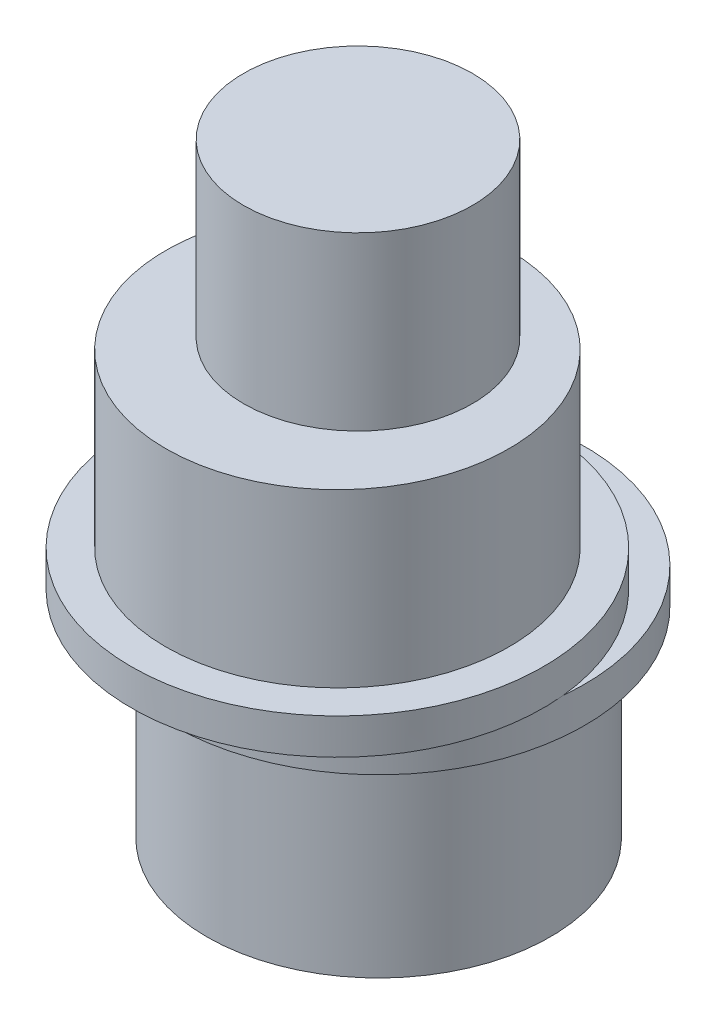
ISO-10303-21;
HEADER;
FILE_DESCRIPTION(('STEP AP214'),'2;1');
FILE_NAME('part.step','',(''),(''),'','','');
FILE_SCHEMA(('AUTOMOTIVE_DESIGN { 1 0 10303 214 1 1 1 1 }'));
ENDSEC;
DATA;
#1=APPLICATION_CONTEXT('core data for automotive mechanical design processes');
#2=APPLICATION_PROTOCOL_DEFINITION('international standard','automotive_design',2000,#1);
#3=PRODUCT_CONTEXT('',#1,'mechanical');
#4=PRODUCT('Part','Part','',(#3));
#5=PRODUCT_RELATED_PRODUCT_CATEGORY('part','',(#4));
#6=PRODUCT_DEFINITION_FORMATION('','',#4);
#7=PRODUCT_DEFINITION_CONTEXT('part definition',#1,'design');
#8=PRODUCT_DEFINITION('design','',#6,#7);
#9=PRODUCT_DEFINITION_SHAPE('','',#8);
#10=(LENGTH_UNIT() NAMED_UNIT(*) SI_UNIT(.MILLI.,.METRE.));
#11=(NAMED_UNIT(*) PLANE_ANGLE_UNIT() SI_UNIT($,.RADIAN.));
#12=(NAMED_UNIT(*) SI_UNIT($,.STERADIAN.) SOLID_ANGLE_UNIT());
#13=UNCERTAINTY_MEASURE_WITH_UNIT(LENGTH_MEASURE(1.E-05),#10,'distance_accuracy_value','');
#14=(GEOMETRIC_REPRESENTATION_CONTEXT(3) GLOBAL_UNCERTAINTY_ASSIGNED_CONTEXT((#13)) GLOBAL_UNIT_ASSIGNED_CONTEXT((#10,
#11,#12)) REPRESENTATION_CONTEXT('',''));
#15=CARTESIAN_POINT('',(0.,0.,0.));
#16=DIRECTION('',(0.,0.,1.));
#17=DIRECTION('',(1.,0.,0.));
#18=AXIS2_PLACEMENT_3D('',#15,#16,#17);
#19=CARTESIAN_POINT('',(0.,7.,-0.72));
#20=DIRECTION('',(0.,-1.,0.));
#21=DIRECTION('',(0.,0.,-1.));
#22=AXIS2_PLACEMENT_3D('',#19,#20,#21);
#23=CYLINDRICAL_SURFACE('',#22,6.);
#24=CARTESIAN_POINT('',(0.,7.,-0.72));
#25=DIRECTION('',(0.,1.,0.));
#26=DIRECTION('',(0.,0.,1.));
#27=AXIS2_PLACEMENT_3D('',#24,#25,#26);
#28=CIRCLE('',#27,6.);
#29=CARTESIAN_POINT('',(0.,7.,5.28));
#30=VERTEX_POINT('',#29);
#31=EDGE_CURVE('E108',#30,#30,#28,.T.);
#32=ORIENTED_EDGE('',*,*,#31,.F.);
#33=EDGE_LOOP('',(#32));
#34=FACE_BOUND('',#33,.T.);
#35=CARTESIAN_POINT('',(0.,0.,-0.72));
#36=DIRECTION('',(0.,1.,0.));
#37=DIRECTION('',(0.,0.,1.));
#38=AXIS2_PLACEMENT_3D('',#35,#36,#37);
#39=CIRCLE('',#38,6.);
#40=CARTESIAN_POINT('',(0.,0.,5.28));
#41=VERTEX_POINT('',#40);
#42=EDGE_CURVE('E121',#41,#41,#39,.T.);
#43=ORIENTED_EDGE('',*,*,#42,.T.);
#44=EDGE_LOOP('',(#43));
#45=FACE_BOUND('',#44,.T.);
#46=ADVANCED_FACE('F45',(#34,#45),#23,.T.);
#47=CARTESIAN_POINT('',(0.,0.,-0.72));
#48=DIRECTION('',(0.,1.,0.));
#49=DIRECTION('',(0.,0.,1.));
#50=AXIS2_PLACEMENT_3D('',#47,#48,#49);
#51=PLANE('',#50);
#52=DIRECTION('',(1.,0.,0.));
#53=VECTOR('',#52,1.);
#54=CARTESIAN_POINT('',(0.,0.,2.1));
#55=LINE('',#54,#53);
#56=CARTESIAN_POINT('',(-1.49017616408262,0.,2.1));
#57=VERTEX_POINT('',#56);
#58=CARTESIAN_POINT('',(1.49017616408262,0.,2.1));
#59=VERTEX_POINT('',#58);
#60=EDGE_CURVE('E107',#57,#59,#55,.T.);
#61=ORIENTED_EDGE('',*,*,#60,.T.);
#62=CARTESIAN_POINT('',(0.,0.,0.));
#63=DIRECTION('',(0.,-1.,0.));
#64=DIRECTION('',(0.,0.,-1.));
#65=AXIS2_PLACEMENT_3D('',#62,#63,#64);
#66=CIRCLE('',#65,2.575);
#67=EDGE_CURVE('E48',#59,#57,#66,.F.);
#68=ORIENTED_EDGE('',*,*,#67,.T.);
#69=EDGE_LOOP('',(#61,#68));
#70=FACE_BOUND('',#69,.T.);
#71=ORIENTED_EDGE('',*,*,#42,.F.);
#72=EDGE_LOOP('',(#71));
#73=FACE_BOUND('',#72,.T.);
#74=ADVANCED_FACE('F134',(#70,#73),#51,.F.);
#75=CARTESIAN_POINT('',(0.,8.25,-0.72));
#76=DIRECTION('',(0.,-1.,0.));
#77=DIRECTION('',(0.,0.,-1.));
#78=AXIS2_PLACEMENT_3D('',#75,#76,#77);
#79=CYLINDRICAL_SURFACE('',#78,7.2);
#80=CARTESIAN_POINT('',(0.,8.25,-0.72));
#81=DIRECTION('',(0.,1.,0.));
#82=DIRECTION('',(0.,0.,1.));
#83=AXIS2_PLACEMENT_3D('',#80,#81,#82);
#84=CIRCLE('',#83,7.2);
#85=CARTESIAN_POINT('',(7.16390954716766,8.25,0.));
#86=VERTEX_POINT('',#85);
#87=CARTESIAN_POINT('',(-7.16390954716766,8.25,0.));
#88=VERTEX_POINT('',#87);
#89=EDGE_CURVE('E118',#86,#88,#84,.T.);
#90=ORIENTED_EDGE('',*,*,#89,.F.);
#91=EDGE_CURVE('E122',#88,#86,#84,.T.);
#92=ORIENTED_EDGE('',*,*,#91,.F.);
#93=EDGE_LOOP('',(#90,#92));
#94=FACE_BOUND('',#93,.T.);
#95=CARTESIAN_POINT('',(0.,7.,-0.72));
#96=DIRECTION('',(0.,1.,0.));
#97=DIRECTION('',(0.,0.,1.));
#98=AXIS2_PLACEMENT_3D('',#95,#96,#97);
#99=CIRCLE('',#98,7.2);
#100=CARTESIAN_POINT('',(0.,7.,6.48));
#101=VERTEX_POINT('',#100);
#102=EDGE_CURVE('E113',#101,#101,#99,.T.);
#103=ORIENTED_EDGE('',*,*,#102,.T.);
#104=EDGE_LOOP('',(#103));
#105=FACE_BOUND('',#104,.T.);
#106=ADVANCED_FACE('F137',(#94,#105),#79,.T.);
#107=CARTESIAN_POINT('',(0.,8.25,-0.72));
#108=DIRECTION('',(0.,1.,0.));
#109=DIRECTION('',(0.,0.,1.));
#110=AXIS2_PLACEMENT_3D('',#107,#108,#109);
#111=PLANE('',#110);
#112=CARTESIAN_POINT('',(0.,8.25,0.72));
#113=DIRECTION('',(0.,1.,0.));
#114=DIRECTION('',(0.,0.,1.));
#115=AXIS2_PLACEMENT_3D('',#112,#113,#114);
#116=CIRCLE('',#115,7.2);
#117=EDGE_CURVE('E114',#86,#88,#116,.T.);
#118=ORIENTED_EDGE('',*,*,#117,.F.);
#119=ORIENTED_EDGE('',*,*,#89,.T.);
#120=EDGE_LOOP('',(#118,#119));
#121=FACE_BOUND('',#120,.T.);
#122=ADVANCED_FACE('F150',(#121),#111,.T.);
#123=CARTESIAN_POINT('',(0.,7.,-0.72));
#124=DIRECTION('',(0.,1.,0.));
#125=DIRECTION('',(0.,0.,1.));
#126=AXIS2_PLACEMENT_3D('',#123,#124,#125);
#127=PLANE('',#126);
#128=ORIENTED_EDGE('',*,*,#31,.T.);
#129=EDGE_LOOP('',(#128));
#130=FACE_BOUND('',#129,.T.);
#131=ORIENTED_EDGE('',*,*,#102,.F.);
#132=EDGE_LOOP('',(#131));
#133=FACE_BOUND('',#132,.T.);
#134=ADVANCED_FACE('F147',(#130,#133),#127,.F.);
#135=CARTESIAN_POINT('',(0.,8.25,0.72));
#136=DIRECTION('',(0.,1.,0.));
#137=DIRECTION('',(0.,0.,1.));
#138=AXIS2_PLACEMENT_3D('',#135,#136,#137);
#139=PLANE('',#138);
#140=EDGE_CURVE('E102',#88,#86,#116,.T.);
#141=ORIENTED_EDGE('',*,*,#140,.F.);
#142=ORIENTED_EDGE('',*,*,#91,.T.);
#143=EDGE_LOOP('',(#141,#142));
#144=FACE_BOUND('',#143,.T.);
#145=ADVANCED_FACE('F149',(#144),#139,.F.);
#146=CARTESIAN_POINT('',(0.,9.5,0.72));
#147=DIRECTION('',(0.,-1.,0.));
#148=DIRECTION('',(0.,0.,-1.));
#149=AXIS2_PLACEMENT_3D('',#146,#147,#148);
#150=CYLINDRICAL_SURFACE('',#149,7.2);
#151=CARTESIAN_POINT('',(0.,9.5,0.72));
#152=DIRECTION('',(0.,1.,0.));
#153=DIRECTION('',(0.,0.,1.));
#154=AXIS2_PLACEMENT_3D('',#151,#152,#153);
#155=CIRCLE('',#154,7.2);
#156=CARTESIAN_POINT('',(0.,9.5,7.92));
#157=VERTEX_POINT('',#156);
#158=EDGE_CURVE('E109',#157,#157,#155,.T.);
#159=ORIENTED_EDGE('',*,*,#158,.F.);
#160=EDGE_LOOP('',(#159));
#161=FACE_BOUND('',#160,.T.);
#162=ORIENTED_EDGE('',*,*,#117,.T.);
#163=ORIENTED_EDGE('',*,*,#140,.T.);
#164=EDGE_LOOP('',(#162,#163));
#165=FACE_BOUND('',#164,.T.);
#166=ADVANCED_FACE('F164',(#161,#165),#150,.T.);
#167=CARTESIAN_POINT('',(0.,9.5,0.72));
#168=DIRECTION('',(0.,1.,0.));
#169=DIRECTION('',(0.,0.,1.));
#170=AXIS2_PLACEMENT_3D('',#167,#168,#169);
#171=PLANE('',#170);
#172=CARTESIAN_POINT('',(0.,9.5,0.72));
#173=DIRECTION('',(0.,1.,0.));
#174=DIRECTION('',(0.,0.,1.));
#175=AXIS2_PLACEMENT_3D('',#172,#173,#174);
#176=CIRCLE('',#175,6.);
#177=CARTESIAN_POINT('',(0.,9.5,6.72));
#178=VERTEX_POINT('',#177);
#179=EDGE_CURVE('E103',#178,#178,#176,.T.);
#180=ORIENTED_EDGE('',*,*,#179,.F.);
#181=EDGE_LOOP('',(#180));
#182=FACE_BOUND('',#181,.T.);
#183=ORIENTED_EDGE('',*,*,#158,.T.);
#184=EDGE_LOOP('',(#183));
#185=FACE_BOUND('',#184,.T.);
#186=ADVANCED_FACE('F167',(#182,#185),#171,.T.);
#187=CARTESIAN_POINT('',(0.,15.5,0.72));
#188=DIRECTION('',(0.,-1.,0.));
#189=DIRECTION('',(0.,0.,-1.));
#190=AXIS2_PLACEMENT_3D('',#187,#188,#189);
#191=CYLINDRICAL_SURFACE('',#190,6.);
#192=CARTESIAN_POINT('',(0.,15.5,0.72));
#193=DIRECTION('',(0.,1.,0.));
#194=DIRECTION('',(0.,0.,1.));
#195=AXIS2_PLACEMENT_3D('',#192,#193,#194);
#196=CIRCLE('',#195,6.);
#197=CARTESIAN_POINT('',(0.,15.5,6.72));
#198=VERTEX_POINT('',#197);
#199=EDGE_CURVE('E98',#198,#198,#196,.T.);
#200=ORIENTED_EDGE('',*,*,#199,.F.);
#201=EDGE_LOOP('',(#200));
#202=FACE_BOUND('',#201,.T.);
#203=ORIENTED_EDGE('',*,*,#179,.T.);
#204=EDGE_LOOP('',(#203));
#205=FACE_BOUND('',#204,.T.);
#206=ADVANCED_FACE('F174',(#202,#205),#191,.T.);
#207=CARTESIAN_POINT('',(0.,15.5,0.72));
#208=DIRECTION('',(0.,1.,0.));
#209=DIRECTION('',(0.,0.,1.));
#210=AXIS2_PLACEMENT_3D('',#207,#208,#209);
#211=PLANE('',#210);
#212=CARTESIAN_POINT('',(0.,15.5,0.));
#213=DIRECTION('',(0.,1.,0.));
#214=DIRECTION('',(0.,0.,1.));
#215=AXIS2_PLACEMENT_3D('',#212,#213,#214);
#216=CIRCLE('',#215,4.);
#217=CARTESIAN_POINT('',(0.,15.5,4.));
#218=VERTEX_POINT('',#217);
#219=EDGE_CURVE('E11',#218,#218,#216,.T.);
#220=ORIENTED_EDGE('',*,*,#219,.F.);
#221=EDGE_LOOP('',(#220));
#222=FACE_BOUND('',#221,.T.);
#223=ORIENTED_EDGE('',*,*,#199,.T.);
#224=EDGE_LOOP('',(#223));
#225=FACE_BOUND('',#224,.T.);
#226=ADVANCED_FACE('F178',(#222,#225),#211,.T.);
#227=CARTESIAN_POINT('',(0.,11.,0.));
#228=DIRECTION('',(0.,-1.,0.));
#229=DIRECTION('',(0.,0.,-1.));
#230=AXIS2_PLACEMENT_3D('',#227,#228,#229);
#231=CYLINDRICAL_SURFACE('',#230,2.575);
#232=DIRECTION('',(0.,-1.,0.));
#233=VECTOR('',#232,1.);
#234=CARTESIAN_POINT('',(1.49017616408262,11.,2.1));
#235=LINE('',#234,#233);
#236=CARTESIAN_POINT('',(1.49017616408262,11.,2.1));
#237=VERTEX_POINT('',#236);
#238=EDGE_CURVE('E62',#237,#59,#235,.T.);
#239=ORIENTED_EDGE('',*,*,#238,.F.);
#240=CARTESIAN_POINT('',(0.,11.,0.));
#241=DIRECTION('',(0.,-1.,0.));
#242=DIRECTION('',(0.,0.,-1.));
#243=AXIS2_PLACEMENT_3D('',#240,#241,#242);
#244=CIRCLE('',#243,2.575);
#245=CARTESIAN_POINT('',(-1.49017616408262,11.,2.1));
#246=VERTEX_POINT('',#245);
#247=EDGE_CURVE('E79',#246,#237,#244,.T.);
#248=ORIENTED_EDGE('',*,*,#247,.F.);
#249=DIRECTION('',(0.,-1.,0.));
#250=VECTOR('',#249,1.);
#251=CARTESIAN_POINT('',(-1.49017616408262,11.,2.1));
#252=LINE('',#251,#250);
#253=EDGE_CURVE('E84',#246,#57,#252,.T.);
#254=ORIENTED_EDGE('',*,*,#253,.T.);
#255=ORIENTED_EDGE('',*,*,#67,.F.);
#256=EDGE_LOOP('',(#239,#248,#254,#255));
#257=FACE_BOUND('',#256,.T.);
#258=ADVANCED_FACE('F77',(#257),#231,.F.);
#259=CARTESIAN_POINT('',(1.49017616408262,11.,2.1));
#260=DIRECTION('',(0.,0.,1.));
#261=DIRECTION('',(1.,0.,0.));
#262=AXIS2_PLACEMENT_3D('',#259,#260,#261);
#263=PLANE('',#262);
#264=ORIENTED_EDGE('',*,*,#253,.F.);
#265=DIRECTION('',(-1.,0.,0.));
#266=VECTOR('',#265,1.);
#267=CARTESIAN_POINT('',(1.49017616408262,11.,2.1));
#268=LINE('',#267,#266);
#269=EDGE_CURVE('E85',#237,#246,#268,.T.);
#270=ORIENTED_EDGE('',*,*,#269,.F.);
#271=ORIENTED_EDGE('',*,*,#238,.T.);
#272=ORIENTED_EDGE('',*,*,#60,.F.);
#273=EDGE_LOOP('',(#264,#270,#271,#272));
#274=FACE_BOUND('',#273,.T.);
#275=ADVANCED_FACE('F92',(#274),#263,.F.);
#276=CARTESIAN_POINT('',(0.,11.,0.));
#277=DIRECTION('',(0.,-1.,0.));
#278=DIRECTION('',(0.,0.,-1.));
#279=AXIS2_PLACEMENT_3D('',#276,#277,#278);
#280=PLANE('',#279);
#281=ORIENTED_EDGE('',*,*,#247,.T.);
#282=ORIENTED_EDGE('',*,*,#269,.T.);
#283=EDGE_LOOP('',(#281,#282));
#284=FACE_BOUND('',#283,.T.);
#285=ADVANCED_FACE('F88',(#284),#280,.T.);
#286=CARTESIAN_POINT('',(0.,21.5,0.));
#287=DIRECTION('',(0.,-1.,0.));
#288=DIRECTION('',(0.,0.,-1.));
#289=AXIS2_PLACEMENT_3D('',#286,#287,#288);
#290=CYLINDRICAL_SURFACE('',#289,4.);
#291=CARTESIAN_POINT('',(0.,21.5,0.));
#292=DIRECTION('',(0.,1.,0.));
#293=DIRECTION('',(0.,0.,1.));
#294=AXIS2_PLACEMENT_3D('',#291,#292,#293);
#295=CIRCLE('',#294,4.);
#296=CARTESIAN_POINT('',(0.,21.5,4.));
#297=VERTEX_POINT('',#296);
#298=EDGE_CURVE('E90',#297,#297,#295,.T.);
#299=ORIENTED_EDGE('',*,*,#298,.F.);
#300=EDGE_LOOP('',(#299));
#301=FACE_BOUND('',#300,.T.);
#302=ORIENTED_EDGE('',*,*,#219,.T.);
#303=EDGE_LOOP('',(#302));
#304=FACE_BOUND('',#303,.T.);
#305=ADVANCED_FACE('F189',(#301,#304),#290,.T.);
#306=CARTESIAN_POINT('',(0.,21.5,0.));
#307=DIRECTION('',(0.,1.,0.));
#308=DIRECTION('',(0.,0.,1.));
#309=AXIS2_PLACEMENT_3D('',#306,#307,#308);
#310=PLANE('',#309);
#311=ORIENTED_EDGE('',*,*,#298,.T.);
#312=EDGE_LOOP('',(#311));
#313=FACE_BOUND('',#312,.T.);
#314=ADVANCED_FACE('F192',(#313),#310,.T.);
#315=CLOSED_SHELL('',(#46,#74,#106,#122,#134,#145,#166,#186,#206,#226,#258,#275,#285,#305,#314));
#316=MANIFOLD_SOLID_BREP('B2',#315);
#317=ADVANCED_BREP_SHAPE_REPRESENTATION('',(#18,#316),#14);
#318=SHAPE_DEFINITION_REPRESENTATION(#9,#317);
ENDSEC;
END-ISO-10303-21;
